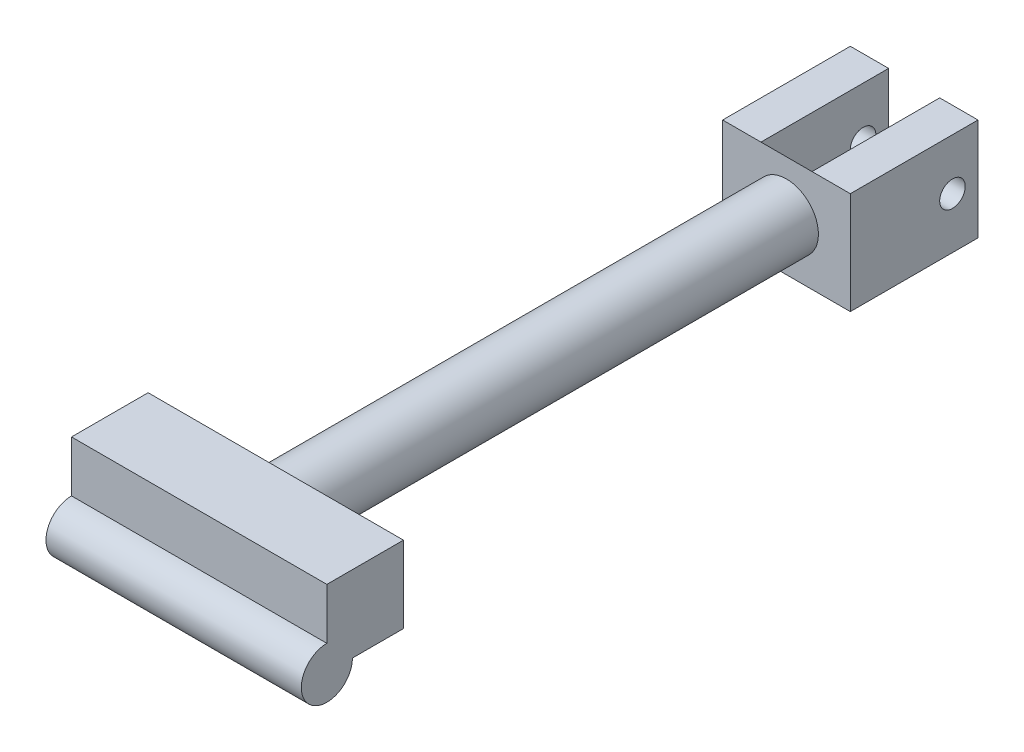
ISO-10303-21;
HEADER;
FILE_DESCRIPTION(('STEP AP214'),'2;1');
FILE_NAME('part.step','',(''),(''),'','','');
FILE_SCHEMA(('AUTOMOTIVE_DESIGN { 1 0 10303 214 1 1 1 1 }'));
ENDSEC;
DATA;
#1=APPLICATION_CONTEXT('core data for automotive mechanical design processes');
#2=APPLICATION_PROTOCOL_DEFINITION('international standard','automotive_design',2000,#1);
#3=PRODUCT_CONTEXT('',#1,'mechanical');
#4=PRODUCT('Part','Part','',(#3));
#5=PRODUCT_RELATED_PRODUCT_CATEGORY('part','',(#4));
#6=PRODUCT_DEFINITION_FORMATION('','',#4);
#7=PRODUCT_DEFINITION_CONTEXT('part definition',#1,'design');
#8=PRODUCT_DEFINITION('design','',#6,#7);
#9=PRODUCT_DEFINITION_SHAPE('','',#8);
#10=(LENGTH_UNIT() NAMED_UNIT(*) SI_UNIT(.MILLI.,.METRE.));
#11=(NAMED_UNIT(*) PLANE_ANGLE_UNIT() SI_UNIT($,.RADIAN.));
#12=(NAMED_UNIT(*) SI_UNIT($,.STERADIAN.) SOLID_ANGLE_UNIT());
#13=UNCERTAINTY_MEASURE_WITH_UNIT(LENGTH_MEASURE(1.E-05),#10,'distance_accuracy_value','');
#14=(GEOMETRIC_REPRESENTATION_CONTEXT(3) GLOBAL_UNCERTAINTY_ASSIGNED_CONTEXT((#13)) GLOBAL_UNIT_ASSIGNED_CONTEXT((#10,
#11,#12)) REPRESENTATION_CONTEXT('',''));
#15=CARTESIAN_POINT('',(0.,0.,0.));
#16=DIRECTION('',(0.,0.,1.));
#17=DIRECTION('',(1.,0.,0.));
#18=AXIS2_PLACEMENT_3D('',#15,#16,#17);
#19=CARTESIAN_POINT('',(25.,35.,-265.));
#20=DIRECTION('',(0.,-1.,0.));
#21=DIRECTION('',(0.,0.,-1.));
#22=AXIS2_PLACEMENT_3D('',#19,#20,#21);
#23=PLANE('',#22);
#24=DIRECTION('',(0.,0.,-1.));
#25=VECTOR('',#24,1.);
#26=CARTESIAN_POINT('',(10.,35.,-230.));
#27=LINE('',#26,#25);
#28=CARTESIAN_POINT('',(10.,35.,-215.));
#29=VERTEX_POINT('',#28);
#30=CARTESIAN_POINT('',(10.,35.,-265.));
#31=VERTEX_POINT('',#30);
#32=EDGE_CURVE('E56',#29,#31,#27,.T.);
#33=ORIENTED_EDGE('',*,*,#32,.F.);
#34=DIRECTION('',(1.,0.,0.));
#35=VECTOR('',#34,1.);
#36=CARTESIAN_POINT('',(25.,35.,-215.));
#37=LINE('',#36,#35);
#38=CARTESIAN_POINT('',(25.,35.,-215.));
#39=VERTEX_POINT('',#38);
#40=EDGE_CURVE('E191',#29,#39,#37,.T.);
#41=ORIENTED_EDGE('',*,*,#40,.T.);
#42=DIRECTION('',(0.,0.,1.));
#43=VECTOR('',#42,1.);
#44=CARTESIAN_POINT('',(25.,35.,-265.));
#45=LINE('',#44,#43);
#46=CARTESIAN_POINT('',(25.,35.,-265.));
#47=VERTEX_POINT('',#46);
#48=EDGE_CURVE('E211',#47,#39,#45,.T.);
#49=ORIENTED_EDGE('',*,*,#48,.F.);
#50=DIRECTION('',(1.,0.,0.));
#51=VECTOR('',#50,1.);
#52=CARTESIAN_POINT('',(25.,35.,-265.));
#53=LINE('',#52,#51);
#54=EDGE_CURVE('E173',#31,#47,#53,.T.);
#55=ORIENTED_EDGE('',*,*,#54,.F.);
#56=EDGE_LOOP('',(#33,#41,#49,#55));
#57=FACE_BOUND('',#56,.T.);
#58=ADVANCED_FACE('F39',(#57),#23,.F.);
#59=CARTESIAN_POINT('',(25.,-5.,-265.));
#60=DIRECTION('',(0.,1.,0.));
#61=DIRECTION('',(0.,0.,1.));
#62=AXIS2_PLACEMENT_3D('',#59,#60,#61);
#63=PLANE('',#62);
#64=DIRECTION('',(-1.,0.,0.));
#65=VECTOR('',#64,1.);
#66=CARTESIAN_POINT('',(25.,-5.,-215.));
#67=LINE('',#66,#65);
#68=CARTESIAN_POINT('',(25.,-5.,-215.));
#69=VERTEX_POINT('',#68);
#70=CARTESIAN_POINT('',(10.,-5.,-215.));
#71=VERTEX_POINT('',#70);
#72=EDGE_CURVE('E199',#69,#71,#67,.T.);
#73=ORIENTED_EDGE('',*,*,#72,.T.);
#74=DIRECTION('',(0.,0.,-1.));
#75=VECTOR('',#74,1.);
#76=CARTESIAN_POINT('',(10.,-5.,-265.));
#77=LINE('',#76,#75);
#78=CARTESIAN_POINT('',(10.,-5.,-265.));
#79=VERTEX_POINT('',#78);
#80=EDGE_CURVE('E310',#71,#79,#77,.T.);
#81=ORIENTED_EDGE('',*,*,#80,.T.);
#82=DIRECTION('',(-1.,0.,0.));
#83=VECTOR('',#82,1.);
#84=CARTESIAN_POINT('',(25.,-5.,-265.));
#85=LINE('',#84,#83);
#86=CARTESIAN_POINT('',(25.,-5.,-265.));
#87=VERTEX_POINT('',#86);
#88=EDGE_CURVE('E182',#87,#79,#85,.T.);
#89=ORIENTED_EDGE('',*,*,#88,.F.);
#90=DIRECTION('',(0.,0.,1.));
#91=VECTOR('',#90,1.);
#92=CARTESIAN_POINT('',(25.,-5.,-265.));
#93=LINE('',#92,#91);
#94=EDGE_CURVE('E207',#87,#69,#93,.T.);
#95=ORIENTED_EDGE('',*,*,#94,.T.);
#96=EDGE_LOOP('',(#73,#81,#89,#95));
#97=FACE_BOUND('',#96,.T.);
#98=ADVANCED_FACE('F352',(#97),#63,.F.);
#99=CARTESIAN_POINT('',(0.,0.,-265.));
#100=DIRECTION('',(0.,0.,-1.));
#101=DIRECTION('',(-1.,0.,0.));
#102=AXIS2_PLACEMENT_3D('',#99,#100,#101);
#103=PLANE('',#102);
#104=DIRECTION('',(0.,1.,0.));
#105=VECTOR('',#104,1.);
#106=CARTESIAN_POINT('',(-10.,0.,-265.));
#107=LINE('',#106,#105);
#108=CARTESIAN_POINT('',(-10.,-5.,-265.));
#109=VERTEX_POINT('',#108);
#110=CARTESIAN_POINT('',(-10.,35.,-265.));
#111=VERTEX_POINT('',#110);
#112=EDGE_CURVE('E145',#109,#111,#107,.T.);
#113=ORIENTED_EDGE('',*,*,#112,.F.);
#114=CARTESIAN_POINT('',(-25.,-5.,-265.));
#115=VERTEX_POINT('',#114);
#116=EDGE_CURVE('E177',#109,#115,#85,.T.);
#117=ORIENTED_EDGE('',*,*,#116,.T.);
#118=DIRECTION('',(0.,1.,0.));
#119=VECTOR('',#118,1.);
#120=CARTESIAN_POINT('',(-25.,35.,-265.));
#121=LINE('',#120,#119);
#122=CARTESIAN_POINT('',(-25.,35.,-265.));
#123=VERTEX_POINT('',#122);
#124=EDGE_CURVE('E169',#115,#123,#121,.T.);
#125=ORIENTED_EDGE('',*,*,#124,.T.);
#126=EDGE_CURVE('E160',#123,#111,#53,.T.);
#127=ORIENTED_EDGE('',*,*,#126,.T.);
#128=EDGE_LOOP('',(#113,#117,#125,#127));
#129=FACE_BOUND('',#128,.T.);
#130=ADVANCED_FACE('F167',(#129),#103,.T.);
#131=CARTESIAN_POINT('',(50.,30.,-15.));
#132=DIRECTION('',(-1.,0.,0.));
#133=DIRECTION('',(0.,0.,1.));
#134=AXIS2_PLACEMENT_3D('',#131,#132,#133);
#135=PLANE('',#134);
#136=DIRECTION('',(0.,-1.,0.));
#137=VECTOR('',#136,1.);
#138=CARTESIAN_POINT('',(50.,30.,15.));
#139=LINE('',#138,#137);
#140=CARTESIAN_POINT('',(50.,30.,15.));
#141=VERTEX_POINT('',#140);
#142=CARTESIAN_POINT('',(50.,10.,15.));
#143=VERTEX_POINT('',#142);
#144=EDGE_CURVE('E251',#141,#143,#139,.T.);
#145=ORIENTED_EDGE('',*,*,#144,.T.);
#146=CARTESIAN_POINT('',(50.,0.,15.));
#147=DIRECTION('',(1.,0.,0.));
#148=DIRECTION('',(0.,0.,-1.));
#149=AXIS2_PLACEMENT_3D('',#146,#147,#148);
#150=CIRCLE('',#149,10.);
#151=CARTESIAN_POINT('',(50.,0.,4.99999999999999));
#152=VERTEX_POINT('',#151);
#153=EDGE_CURVE('E222',#143,#152,#150,.T.);
#154=ORIENTED_EDGE('',*,*,#153,.T.);
#155=DIRECTION('',(0.,0.,-1.));
#156=VECTOR('',#155,1.);
#157=CARTESIAN_POINT('',(50.,0.,-15.));
#158=LINE('',#157,#156);
#159=CARTESIAN_POINT('',(50.,0.,-15.));
#160=VERTEX_POINT('',#159);
#161=EDGE_CURVE('E236',#152,#160,#158,.T.);
#162=ORIENTED_EDGE('',*,*,#161,.T.);
#163=DIRECTION('',(0.,-1.,0.));
#164=VECTOR('',#163,1.);
#165=CARTESIAN_POINT('',(50.,30.,-15.));
#166=LINE('',#165,#164);
#167=CARTESIAN_POINT('',(50.,30.,-15.));
#168=VERTEX_POINT('',#167);
#169=EDGE_CURVE('E271',#168,#160,#166,.T.);
#170=ORIENTED_EDGE('',*,*,#169,.F.);
#171=DIRECTION('',(0.,0.,-1.));
#172=VECTOR('',#171,1.);
#173=CARTESIAN_POINT('',(50.,30.,-15.));
#174=LINE('',#173,#172);
#175=EDGE_CURVE('E237',#141,#168,#174,.T.);
#176=ORIENTED_EDGE('',*,*,#175,.F.);
#177=EDGE_LOOP('',(#145,#154,#162,#170,#176));
#178=FACE_BOUND('',#177,.T.);
#179=ADVANCED_FACE('F421',(#178),#135,.F.);
#180=CARTESIAN_POINT('',(-50.,30.,-15.));
#181=DIRECTION('',(0.,0.,1.));
#182=DIRECTION('',(1.,0.,0.));
#183=AXIS2_PLACEMENT_3D('',#180,#181,#182);
#184=PLANE('',#183);
#185=CARTESIAN_POINT('',(0.,15.,-15.));
#186=DIRECTION('',(0.,0.,-1.));
#187=DIRECTION('',(-1.,0.,0.));
#188=AXIS2_PLACEMENT_3D('',#185,#186,#187);
#189=CIRCLE('',#188,12.5);
#190=CARTESIAN_POINT('',(12.5,15.,-15.));
#191=VERTEX_POINT('',#190);
#192=EDGE_CURVE('E154',#191,#191,#189,.T.);
#193=ORIENTED_EDGE('',*,*,#192,.F.);
#194=EDGE_LOOP('',(#193));
#195=FACE_BOUND('',#194,.T.);
#196=DIRECTION('',(-1.,0.,0.));
#197=VECTOR('',#196,1.);
#198=CARTESIAN_POINT('',(-50.,0.,-15.));
#199=LINE('',#198,#197);
#200=CARTESIAN_POINT('',(-50.,0.,-15.));
#201=VERTEX_POINT('',#200);
#202=EDGE_CURVE('E254',#160,#201,#199,.T.);
#203=ORIENTED_EDGE('',*,*,#202,.T.);
#204=DIRECTION('',(0.,-1.,0.));
#205=VECTOR('',#204,1.);
#206=CARTESIAN_POINT('',(-50.,30.,-15.));
#207=LINE('',#206,#205);
#208=CARTESIAN_POINT('',(-50.,30.,-15.));
#209=VERTEX_POINT('',#208);
#210=EDGE_CURVE('E267',#209,#201,#207,.T.);
#211=ORIENTED_EDGE('',*,*,#210,.F.);
#212=DIRECTION('',(-1.,0.,0.));
#213=VECTOR('',#212,1.);
#214=CARTESIAN_POINT('',(-50.,30.,-15.));
#215=LINE('',#214,#213);
#216=EDGE_CURVE('E241',#168,#209,#215,.T.);
#217=ORIENTED_EDGE('',*,*,#216,.F.);
#218=ORIENTED_EDGE('',*,*,#169,.T.);
#219=EDGE_LOOP('',(#203,#211,#217,#218));
#220=FACE_BOUND('',#219,.T.);
#221=ADVANCED_FACE('F424',(#195,#220),#184,.F.);
#222=CARTESIAN_POINT('',(-50.,30.,-15.));
#223=DIRECTION('',(1.,0.,0.));
#224=DIRECTION('',(0.,0.,-1.));
#225=AXIS2_PLACEMENT_3D('',#222,#223,#224);
#226=PLANE('',#225);
#227=DIRECTION('',(0.,0.,1.));
#228=VECTOR('',#227,1.);
#229=CARTESIAN_POINT('',(-50.,0.,-15.));
#230=LINE('',#229,#228);
#231=CARTESIAN_POINT('',(-50.,0.,4.99999999999997));
#232=VERTEX_POINT('',#231);
#233=EDGE_CURVE('E242',#201,#232,#230,.T.);
#234=ORIENTED_EDGE('',*,*,#233,.T.);
#235=CARTESIAN_POINT('',(-50.,0.,15.));
#236=DIRECTION('',(1.,0.,0.));
#237=DIRECTION('',(0.,0.,-1.));
#238=AXIS2_PLACEMENT_3D('',#235,#236,#237);
#239=CIRCLE('',#238,10.);
#240=CARTESIAN_POINT('',(-50.,10.,15.));
#241=VERTEX_POINT('',#240);
#242=EDGE_CURVE('E227',#241,#232,#239,.T.);
#243=ORIENTED_EDGE('',*,*,#242,.F.);
#244=DIRECTION('',(0.,-1.,0.));
#245=VECTOR('',#244,1.);
#246=CARTESIAN_POINT('',(-50.,30.,15.));
#247=LINE('',#246,#245);
#248=CARTESIAN_POINT('',(-50.,30.,15.));
#249=VERTEX_POINT('',#248);
#250=EDGE_CURVE('E263',#249,#241,#247,.T.);
#251=ORIENTED_EDGE('',*,*,#250,.F.);
#252=DIRECTION('',(0.,0.,1.));
#253=VECTOR('',#252,1.);
#254=CARTESIAN_POINT('',(-50.,30.,-15.));
#255=LINE('',#254,#253);
#256=EDGE_CURVE('E245',#209,#249,#255,.T.);
#257=ORIENTED_EDGE('',*,*,#256,.F.);
#258=ORIENTED_EDGE('',*,*,#210,.T.);
#259=EDGE_LOOP('',(#234,#243,#251,#257,#258));
#260=FACE_BOUND('',#259,.T.);
#261=ADVANCED_FACE('F428',(#260),#226,.F.);
#262=CARTESIAN_POINT('',(-50.,30.,15.));
#263=DIRECTION('',(0.,0.,-1.));
#264=DIRECTION('',(-1.,0.,0.));
#265=AXIS2_PLACEMENT_3D('',#262,#263,#264);
#266=PLANE('',#265);
#267=ORIENTED_EDGE('',*,*,#250,.T.);
#268=DIRECTION('',(1.,0.,0.));
#269=VECTOR('',#268,1.);
#270=CARTESIAN_POINT('',(-50.,10.,15.));
#271=LINE('',#270,#269);
#272=EDGE_CURVE('E230',#241,#143,#271,.T.);
#273=ORIENTED_EDGE('',*,*,#272,.T.);
#274=ORIENTED_EDGE('',*,*,#144,.F.);
#275=DIRECTION('',(1.,0.,0.));
#276=VECTOR('',#275,1.);
#277=CARTESIAN_POINT('',(-50.,30.,15.));
#278=LINE('',#277,#276);
#279=EDGE_CURVE('E248',#249,#141,#278,.T.);
#280=ORIENTED_EDGE('',*,*,#279,.F.);
#281=EDGE_LOOP('',(#267,#273,#274,#280));
#282=FACE_BOUND('',#281,.T.);
#283=ADVANCED_FACE('F432',(#282),#266,.F.);
#284=CARTESIAN_POINT('',(0.,30.,0.));
#285=DIRECTION('',(0.,1.,0.));
#286=DIRECTION('',(0.,0.,1.));
#287=AXIS2_PLACEMENT_3D('',#284,#285,#286);
#288=PLANE('',#287);
#289=ORIENTED_EDGE('',*,*,#175,.T.);
#290=ORIENTED_EDGE('',*,*,#216,.T.);
#291=ORIENTED_EDGE('',*,*,#256,.T.);
#292=ORIENTED_EDGE('',*,*,#279,.T.);
#293=EDGE_LOOP('',(#289,#290,#291,#292));
#294=FACE_BOUND('',#293,.T.);
#295=ADVANCED_FACE('F436',(#294),#288,.T.);
#296=CARTESIAN_POINT('',(0.,0.,0.));
#297=DIRECTION('',(0.,1.,0.));
#298=DIRECTION('',(0.,0.,1.));
#299=AXIS2_PLACEMENT_3D('',#296,#297,#298);
#300=PLANE('',#299);
#301=ORIENTED_EDGE('',*,*,#161,.F.);
#302=DIRECTION('',(1.,0.,0.));
#303=VECTOR('',#302,1.);
#304=CARTESIAN_POINT('',(-50.,0.,4.99999999999997));
#305=LINE('',#304,#303);
#306=EDGE_CURVE('E226',#152,#232,#305,.F.);
#307=ORIENTED_EDGE('',*,*,#306,.T.);
#308=ORIENTED_EDGE('',*,*,#233,.F.);
#309=ORIENTED_EDGE('',*,*,#202,.F.);
#310=EDGE_LOOP('',(#301,#307,#308,#309));
#311=FACE_BOUND('',#310,.T.);
#312=ADVANCED_FACE('F438',(#311),#300,.F.);
#313=CARTESIAN_POINT('',(-50.,0.,15.));
#314=DIRECTION('',(1.,0.,0.));
#315=DIRECTION('',(0.,0.,-1.));
#316=AXIS2_PLACEMENT_3D('',#313,#314,#315);
#317=CYLINDRICAL_SURFACE('',#316,10.);
#318=ORIENTED_EDGE('',*,*,#272,.F.);
#319=ORIENTED_EDGE('',*,*,#242,.T.);
#320=ORIENTED_EDGE('',*,*,#306,.F.);
#321=ORIENTED_EDGE('',*,*,#153,.F.);
#322=EDGE_LOOP('',(#318,#319,#320,#321));
#323=FACE_BOUND('',#322,.T.);
#324=ADVANCED_FACE('F375',(#323),#317,.T.);
#325=CARTESIAN_POINT('',(0.,15.,-215.));
#326=DIRECTION('',(0.,0.,1.));
#327=DIRECTION('',(1.,0.,0.));
#328=AXIS2_PLACEMENT_3D('',#325,#326,#327);
#329=CYLINDRICAL_SURFACE('',#328,12.5);
#330=CARTESIAN_POINT('',(0.,15.,-215.));
#331=DIRECTION('',(0.,0.,-1.));
#332=DIRECTION('',(-1.,0.,0.));
#333=AXIS2_PLACEMENT_3D('',#330,#331,#332);
#334=CIRCLE('',#333,12.5);
#335=CARTESIAN_POINT('',(12.5,15.,-215.));
#336=VERTEX_POINT('',#335);
#337=EDGE_CURVE('E218',#336,#336,#334,.T.);
#338=CARTESIAN_POINT('',(12.5,15.,-215.));
#339=CARTESIAN_POINT('',(12.5,15.,-212.916666666667));
#340=CARTESIAN_POINT('',(12.5,15.,-210.833333333333));
#341=CARTESIAN_POINT('',(12.5,15.,-206.666666666667));
#342=CARTESIAN_POINT('',(12.5,15.,-204.583333333333));
#343=CARTESIAN_POINT('',(12.5,15.,-200.416666666667));
#344=CARTESIAN_POINT('',(12.5,15.,-198.333333333333));
#345=CARTESIAN_POINT('',(12.5,15.,-194.166666666667));
#346=CARTESIAN_POINT('',(12.5,15.,-192.083333333333));
#347=CARTESIAN_POINT('',(12.5,15.,-187.916666666667));
#348=CARTESIAN_POINT('',(12.5,15.,-185.833333333333));
#349=CARTESIAN_POINT('',(12.5,15.,-181.666666666667));
#350=CARTESIAN_POINT('',(12.5,15.,-179.583333333333));
#351=CARTESIAN_POINT('',(12.5,15.,-175.416666666667));
#352=CARTESIAN_POINT('',(12.5,15.,-173.333333333333));
#353=CARTESIAN_POINT('',(12.5,15.,-169.166666666667));
#354=CARTESIAN_POINT('',(12.5,15.,-167.083333333333));
#355=CARTESIAN_POINT('',(12.5,15.,-162.916666666667));
#356=CARTESIAN_POINT('',(12.5,15.,-160.833333333333));
#357=CARTESIAN_POINT('',(12.5,15.,-156.666666666667));
#358=CARTESIAN_POINT('',(12.5,15.,-154.583333333333));
#359=CARTESIAN_POINT('',(12.5,15.,-150.416666666667));
#360=CARTESIAN_POINT('',(12.5,15.,-148.333333333333));
#361=CARTESIAN_POINT('',(12.5,15.,-144.166666666667));
#362=CARTESIAN_POINT('',(12.5,15.,-142.083333333333));
#363=CARTESIAN_POINT('',(12.5,15.,-137.916666666667));
#364=CARTESIAN_POINT('',(12.5,15.,-135.833333333333));
#365=CARTESIAN_POINT('',(12.5,15.,-131.666666666667));
#366=CARTESIAN_POINT('',(12.5,15.,-129.583333333333));
#367=CARTESIAN_POINT('',(12.5,15.,-125.416666666667));
#368=CARTESIAN_POINT('',(12.5,15.,-123.333333333333));
#369=CARTESIAN_POINT('',(12.5,15.,-119.166666666667));
#370=CARTESIAN_POINT('',(12.5,15.,-117.083333333333));
#371=CARTESIAN_POINT('',(12.5,15.,-112.916666666667));
#372=CARTESIAN_POINT('',(12.5,15.,-110.833333333333));
#373=CARTESIAN_POINT('',(12.5,15.,-106.666666666667));
#374=CARTESIAN_POINT('',(12.5,15.,-104.583333333333));
#375=CARTESIAN_POINT('',(12.5,15.,-100.416666666667));
#376=CARTESIAN_POINT('',(12.5,15.,-98.3333333333334));
#377=CARTESIAN_POINT('',(12.5,15.,-94.1666666666667));
#378=CARTESIAN_POINT('',(12.5,15.,-92.0833333333334));
#379=CARTESIAN_POINT('',(12.5,15.,-87.9166666666667));
#380=CARTESIAN_POINT('',(12.5,15.,-85.8333333333334));
#381=CARTESIAN_POINT('',(12.5,15.,-81.6666666666667));
#382=CARTESIAN_POINT('',(12.5,15.,-79.5833333333334));
#383=CARTESIAN_POINT('',(12.5,15.,-75.4166666666667));
#384=CARTESIAN_POINT('',(12.5,15.,-73.3333333333334));
#385=CARTESIAN_POINT('',(12.5,15.,-69.1666666666667));
#386=CARTESIAN_POINT('',(12.5,15.,-67.0833333333334));
#387=CARTESIAN_POINT('',(12.5,15.,-62.9166666666667));
#388=CARTESIAN_POINT('',(12.5,15.,-60.8333333333334));
#389=CARTESIAN_POINT('',(12.5,15.,-56.6666666666667));
#390=CARTESIAN_POINT('',(12.5,15.,-54.5833333333333));
#391=CARTESIAN_POINT('',(12.5,15.,-50.4166666666667));
#392=CARTESIAN_POINT('',(12.5,15.,-48.3333333333334));
#393=CARTESIAN_POINT('',(12.5,15.,-44.1666666666667));
#394=CARTESIAN_POINT('',(12.5,15.,-42.0833333333334));
#395=CARTESIAN_POINT('',(12.5,15.,-37.9166666666667));
#396=CARTESIAN_POINT('',(12.5,15.,-35.8333333333334));
#397=CARTESIAN_POINT('',(12.5,15.,-31.6666666666667));
#398=CARTESIAN_POINT('',(12.5,15.,-29.5833333333334));
#399=CARTESIAN_POINT('',(12.5,15.,-25.4166666666667));
#400=CARTESIAN_POINT('',(12.5,15.,-23.3333333333334));
#401=CARTESIAN_POINT('',(12.5,15.,-19.1666666666667));
#402=CARTESIAN_POINT('',(12.5,15.,-17.0833333333333));
#403=CARTESIAN_POINT('',(12.5,15.,-15.));
#404=B_SPLINE_CURVE_WITH_KNOTS('',3,(#338,#339,#340,#341,#342,#343,#344,#345,#346,#347,#348,
#349,#350,#351,#352,#353,#354,#355,#356,#357,#358,#359,#360,#361,#362,#363,#364,#365,#366,#367,
#368,#369,#370,#371,#372,#373,#374,#375,#376,#377,#378,#379,#380,#381,#382,#383,#384,#385,#386,
#387,#388,#389,#390,#391,#392,#393,#394,#395,#396,#397,#398,#399,#400,#401,#402,#403),
.UNSPECIFIED.,.F.,.F.,(4,2,2,2,2,2,2,2,2,2,2,2,2,2,2,2,2,2,2,2,2,2,2,2,2,2,2,2,2,2,2,2,4),(0.,
6.24999999999998,12.5,18.75,25.,31.25,37.5,43.75,50.,56.25,62.5,68.75,75.,81.25,87.5,93.75,100.,
106.25,112.5,118.75,125.,131.25,137.5,143.75,150.,156.25,162.5,168.75,175.,181.25,187.5,193.75,
200.),.UNSPECIFIED.);
#405=EDGE_CURVE('BSEAM367',#336,#191,#404,.T.);
#406=ORIENTED_EDGE('',*,*,#337,.F.);
#407=ORIENTED_EDGE('',*,*,#192,.T.);
#408=ORIENTED_EDGE('',*,*,#405,.T.);
#409=ORIENTED_EDGE('',*,*,#405,.F.);
#410=EDGE_LOOP('',(#406,#408,#407,#409));
#411=FACE_BOUND('',#410,.T.);
#412=ADVANCED_FACE('F367',(#411),#329,.T.);
#413=CARTESIAN_POINT('',(-25.,35.,-265.));
#414=DIRECTION('',(1.,0.,0.));
#415=DIRECTION('',(0.,1.,0.));
#416=AXIS2_PLACEMENT_3D('',#413,#414,#415);
#417=PLANE('',#416);
#418=CARTESIAN_POINT('',(-25.,15.,-255.));
#419=DIRECTION('',(1.,0.,0.));
#420=DIRECTION('',(0.,1.,0.));
#421=AXIS2_PLACEMENT_3D('',#418,#419,#420);
#422=CIRCLE('',#421,4.99999999999999);
#423=CARTESIAN_POINT('',(-25.,20.,-255.));
#424=VERTEX_POINT('',#423);
#425=EDGE_CURVE('E324',#424,#424,#422,.T.);
#426=ORIENTED_EDGE('',*,*,#425,.T.);
#427=EDGE_LOOP('',(#426));
#428=FACE_BOUND('',#427,.T.);
#429=DIRECTION('',(0.,1.,0.));
#430=VECTOR('',#429,1.);
#431=CARTESIAN_POINT('',(-25.,35.,-215.));
#432=LINE('',#431,#430);
#433=CARTESIAN_POINT('',(-25.,-5.,-215.));
#434=VERTEX_POINT('',#433);
#435=CARTESIAN_POINT('',(-25.,35.,-215.));
#436=VERTEX_POINT('',#435);
#437=EDGE_CURVE('E187',#434,#436,#432,.T.);
#438=ORIENTED_EDGE('',*,*,#437,.T.);
#439=DIRECTION('',(0.,0.,1.));
#440=VECTOR('',#439,1.);
#441=CARTESIAN_POINT('',(-25.,35.,-265.));
#442=LINE('',#441,#440);
#443=EDGE_CURVE('E215',#123,#436,#442,.T.);
#444=ORIENTED_EDGE('',*,*,#443,.F.);
#445=ORIENTED_EDGE('',*,*,#124,.F.);
#446=DIRECTION('',(0.,0.,1.));
#447=VECTOR('',#446,1.);
#448=CARTESIAN_POINT('',(-25.,-5.,-265.));
#449=LINE('',#448,#447);
#450=EDGE_CURVE('E186',#115,#434,#449,.T.);
#451=ORIENTED_EDGE('',*,*,#450,.T.);
#452=EDGE_LOOP('',(#438,#444,#445,#451));
#453=FACE_BOUND('',#452,.T.);
#454=ADVANCED_FACE('F364',(#428,#453),#417,.F.);
#455=CARTESIAN_POINT('',(-9.99999999999999,35.,-215.));
#456=VERTEX_POINT('',#455);
#457=EDGE_CURVE('E162',#436,#456,#37,.T.);
#458=ORIENTED_EDGE('',*,*,#457,.T.);
#459=DIRECTION('',(0.,0.,-1.));
#460=VECTOR('',#459,1.);
#461=CARTESIAN_POINT('',(-10.,35.,-230.));
#462=LINE('',#461,#460);
#463=EDGE_CURVE('E63',#456,#111,#462,.T.);
#464=ORIENTED_EDGE('',*,*,#463,.T.);
#465=ORIENTED_EDGE('',*,*,#126,.F.);
#466=ORIENTED_EDGE('',*,*,#443,.T.);
#467=EDGE_LOOP('',(#458,#464,#465,#466));
#468=FACE_BOUND('',#467,.T.);
#469=ADVANCED_FACE('F158',(#468),#23,.F.);
#470=CARTESIAN_POINT('',(25.,35.,-265.));
#471=DIRECTION('',(-1.,0.,0.));
#472=DIRECTION('',(0.,-1.,0.));
#473=AXIS2_PLACEMENT_3D('',#470,#471,#472);
#474=PLANE('',#473);
#475=CARTESIAN_POINT('',(25.,15.,-255.));
#476=DIRECTION('',(1.,0.,0.));
#477=DIRECTION('',(0.,1.,0.));
#478=AXIS2_PLACEMENT_3D('',#475,#476,#477);
#479=CIRCLE('',#478,4.99999999999999);
#480=CARTESIAN_POINT('',(25.,20.,-255.));
#481=VERTEX_POINT('',#480);
#482=EDGE_CURVE('E335',#481,#481,#479,.T.);
#483=ORIENTED_EDGE('',*,*,#482,.F.);
#484=EDGE_LOOP('',(#483));
#485=FACE_BOUND('',#484,.T.);
#486=DIRECTION('',(0.,-1.,0.));
#487=VECTOR('',#486,1.);
#488=CARTESIAN_POINT('',(25.,35.,-215.));
#489=LINE('',#488,#487);
#490=EDGE_CURVE('E194',#39,#69,#489,.T.);
#491=ORIENTED_EDGE('',*,*,#490,.T.);
#492=ORIENTED_EDGE('',*,*,#94,.F.);
#493=DIRECTION('',(0.,-1.,0.));
#494=VECTOR('',#493,1.);
#495=CARTESIAN_POINT('',(25.,35.,-265.));
#496=LINE('',#495,#494);
#497=EDGE_CURVE('E172',#47,#87,#496,.T.);
#498=ORIENTED_EDGE('',*,*,#497,.F.);
#499=ORIENTED_EDGE('',*,*,#48,.T.);
#500=EDGE_LOOP('',(#491,#492,#498,#499));
#501=FACE_BOUND('',#500,.T.);
#502=ADVANCED_FACE('F343',(#485,#501),#474,.F.);
#503=DIRECTION('',(0.,0.,1.));
#504=VECTOR('',#503,1.);
#505=CARTESIAN_POINT('',(-10.,-5.,-265.));
#506=LINE('',#505,#504);
#507=CARTESIAN_POINT('',(-10.,-5.,-215.));
#508=VERTEX_POINT('',#507);
#509=EDGE_CURVE('E148',#109,#508,#506,.T.);
#510=ORIENTED_EDGE('',*,*,#509,.T.);
#511=EDGE_CURVE('E198',#508,#434,#67,.T.);
#512=ORIENTED_EDGE('',*,*,#511,.T.);
#513=ORIENTED_EDGE('',*,*,#450,.F.);
#514=ORIENTED_EDGE('',*,*,#116,.F.);
#515=EDGE_LOOP('',(#510,#512,#513,#514));
#516=FACE_BOUND('',#515,.T.);
#517=ADVANCED_FACE('F346',(#516),#63,.F.);
#518=DIRECTION('',(0.,-1.,0.));
#519=VECTOR('',#518,1.);
#520=CARTESIAN_POINT('',(10.,-35.,-265.));
#521=LINE('',#520,#519);
#522=EDGE_CURVE('E321',#31,#79,#521,.T.);
#523=ORIENTED_EDGE('',*,*,#522,.F.);
#524=ORIENTED_EDGE('',*,*,#54,.T.);
#525=ORIENTED_EDGE('',*,*,#497,.T.);
#526=ORIENTED_EDGE('',*,*,#88,.T.);
#527=EDGE_LOOP('',(#523,#524,#525,#526));
#528=FACE_BOUND('',#527,.T.);
#529=ADVANCED_FACE('F385',(#528),#103,.T.);
#530=CARTESIAN_POINT('',(0.,0.,-215.));
#531=DIRECTION('',(0.,0.,-1.));
#532=DIRECTION('',(-1.,0.,0.));
#533=AXIS2_PLACEMENT_3D('',#530,#531,#532);
#534=PLANE('',#533);
#535=ORIENTED_EDGE('',*,*,#337,.T.);
#536=EDGE_LOOP('',(#535));
#537=FACE_BOUND('',#536,.T.);
#538=ORIENTED_EDGE('',*,*,#437,.F.);
#539=ORIENTED_EDGE('',*,*,#511,.F.);
#540=EDGE_CURVE('E203',#71,#508,#67,.T.);
#541=ORIENTED_EDGE('',*,*,#540,.F.);
#542=ORIENTED_EDGE('',*,*,#72,.F.);
#543=ORIENTED_EDGE('',*,*,#490,.F.);
#544=ORIENTED_EDGE('',*,*,#40,.F.);
#545=EDGE_CURVE('E195',#456,#29,#37,.T.);
#546=ORIENTED_EDGE('',*,*,#545,.F.);
#547=ORIENTED_EDGE('',*,*,#457,.F.);
#548=EDGE_LOOP('',(#538,#539,#541,#542,#543,#544,#546,#547));
#549=FACE_BOUND('',#548,.T.);
#550=ADVANCED_FACE('F303',(#537,#549),#534,.F.);
#551=CARTESIAN_POINT('',(0.,0.,-230.));
#552=DIRECTION('',(0.,0.,1.));
#553=DIRECTION('',(1.,0.,0.));
#554=AXIS2_PLACEMENT_3D('',#551,#552,#553);
#555=PLANE('',#554);
#556=DIRECTION('',(0.,-1.,0.));
#557=VECTOR('',#556,1.);
#558=CARTESIAN_POINT('',(10.,-35.,-230.));
#559=LINE('',#558,#557);
#560=CARTESIAN_POINT('',(10.,20.,-230.));
#561=VERTEX_POINT('',#560);
#562=CARTESIAN_POINT('',(10.,10.0000000000001,-230.));
#563=VERTEX_POINT('',#562);
#564=EDGE_CURVE('E165',#561,#563,#559,.T.);
#565=ORIENTED_EDGE('',*,*,#564,.T.);
#566=DIRECTION('',(-1.,0.,0.));
#567=VECTOR('',#566,1.);
#568=CARTESIAN_POINT('',(0.,10.0000000000001,-230.));
#569=LINE('',#568,#567);
#570=CARTESIAN_POINT('',(-10.,10.0000000000001,-230.));
#571=VERTEX_POINT('',#570);
#572=EDGE_CURVE('E281',#563,#571,#569,.T.);
#573=ORIENTED_EDGE('',*,*,#572,.T.);
#574=DIRECTION('',(0.,1.,0.));
#575=VECTOR('',#574,1.);
#576=CARTESIAN_POINT('',(-10.,-35.,-230.));
#577=LINE('',#576,#575);
#578=CARTESIAN_POINT('',(-10.,20.,-230.));
#579=VERTEX_POINT('',#578);
#580=EDGE_CURVE('E317',#571,#579,#577,.T.);
#581=ORIENTED_EDGE('',*,*,#580,.T.);
#582=DIRECTION('',(1.,0.,0.));
#583=VECTOR('',#582,1.);
#584=CARTESIAN_POINT('',(0.,20.,-230.));
#585=LINE('',#584,#583);
#586=EDGE_CURVE('E153',#579,#561,#585,.T.);
#587=ORIENTED_EDGE('',*,*,#586,.T.);
#588=EDGE_LOOP('',(#565,#573,#581,#587));
#589=FACE_BOUND('',#588,.T.);
#590=ADVANCED_FACE('F388',(#589),#555,.F.);
#591=CARTESIAN_POINT('',(-10.,-35.,-230.));
#592=DIRECTION('',(-1.,0.,0.));
#593=DIRECTION('',(0.,0.,1.));
#594=AXIS2_PLACEMENT_3D('',#591,#592,#593);
#595=PLANE('',#594);
#596=CARTESIAN_POINT('',(-10.,15.,-255.));
#597=DIRECTION('',(-1.,0.,0.));
#598=DIRECTION('',(0.,0.,1.));
#599=AXIS2_PLACEMENT_3D('',#596,#597,#598);
#600=CIRCLE('',#599,4.99999999999999);
#601=CARTESIAN_POINT('',(-10.,15.,-250.));
#602=VERTEX_POINT('',#601);
#603=EDGE_CURVE('E328',#602,#602,#600,.T.);
#604=ORIENTED_EDGE('',*,*,#603,.T.);
#605=EDGE_LOOP('',(#604));
#606=FACE_BOUND('',#605,.T.);
#607=ORIENTED_EDGE('',*,*,#112,.T.);
#608=ORIENTED_EDGE('',*,*,#463,.F.);
#609=DIRECTION('',(0.,0.707106781186546,0.707106781186549));
#610=VECTOR('',#609,1.);
#611=CARTESIAN_POINT('',(-10.,-7.49999999999991,-257.5));
#612=LINE('',#611,#610);
#613=EDGE_CURVE('E11',#456,#579,#612,.F.);
#614=ORIENTED_EDGE('',*,*,#613,.T.);
#615=ORIENTED_EDGE('',*,*,#580,.F.);
#616=DIRECTION('',(0.,0.707106781186549,-0.707106781186546));
#617=VECTOR('',#616,1.);
#618=CARTESIAN_POINT('',(-10.,-12.5,-207.5));
#619=LINE('',#618,#617);
#620=EDGE_CURVE('E287',#571,#508,#619,.F.);
#621=ORIENTED_EDGE('',*,*,#620,.T.);
#622=ORIENTED_EDGE('',*,*,#509,.F.);
#623=EDGE_LOOP('',(#607,#608,#614,#615,#621,#622));
#624=FACE_BOUND('',#623,.T.);
#625=ADVANCED_FACE('F146',(#606,#624),#595,.F.);
#626=CARTESIAN_POINT('',(10.,-35.,-230.));
#627=DIRECTION('',(1.,0.,0.));
#628=DIRECTION('',(0.,0.,-1.));
#629=AXIS2_PLACEMENT_3D('',#626,#627,#628);
#630=PLANE('',#629);
#631=CARTESIAN_POINT('',(10.,15.,-255.));
#632=DIRECTION('',(1.,0.,0.));
#633=DIRECTION('',(0.,0.,-1.));
#634=AXIS2_PLACEMENT_3D('',#631,#632,#633);
#635=CIRCLE('',#634,4.99999999999999);
#636=CARTESIAN_POINT('',(10.,15.,-260.));
#637=VERTEX_POINT('',#636);
#638=EDGE_CURVE('E43',#637,#637,#635,.T.);
#639=ORIENTED_EDGE('',*,*,#638,.T.);
#640=EDGE_LOOP('',(#639));
#641=FACE_BOUND('',#640,.T.);
#642=ORIENTED_EDGE('',*,*,#564,.F.);
#643=DIRECTION('',(0.,-0.707106781186546,-0.707106781186549));
#644=VECTOR('',#643,1.);
#645=CARTESIAN_POINT('',(10.,-7.49999999999991,-257.5));
#646=LINE('',#645,#644);
#647=EDGE_CURVE('E49',#561,#29,#646,.F.);
#648=ORIENTED_EDGE('',*,*,#647,.T.);
#649=ORIENTED_EDGE('',*,*,#32,.T.);
#650=ORIENTED_EDGE('',*,*,#522,.T.);
#651=ORIENTED_EDGE('',*,*,#80,.F.);
#652=DIRECTION('',(0.,-0.707106781186549,0.707106781186546));
#653=VECTOR('',#652,1.);
#654=CARTESIAN_POINT('',(10.,-12.5,-207.5));
#655=LINE('',#654,#653);
#656=EDGE_CURVE('E284',#71,#563,#655,.F.);
#657=ORIENTED_EDGE('',*,*,#656,.T.);
#658=EDGE_LOOP('',(#642,#648,#649,#650,#651,#657));
#659=FACE_BOUND('',#658,.T.);
#660=ADVANCED_FACE('F294',(#641,#659),#630,.F.);
#661=CARTESIAN_POINT('',(25.,-5.,-215.));
#662=DIRECTION('',(0.,0.707106781186546,0.707106781186549));
#663=DIRECTION('',(1.,0.,0.));
#664=AXIS2_PLACEMENT_3D('',#661,#662,#663);
#665=PLANE('',#664);
#666=ORIENTED_EDGE('',*,*,#620,.F.);
#667=ORIENTED_EDGE('',*,*,#572,.F.);
#668=ORIENTED_EDGE('',*,*,#656,.F.);
#669=ORIENTED_EDGE('',*,*,#540,.T.);
#670=EDGE_LOOP('',(#666,#667,#668,#669));
#671=FACE_BOUND('',#670,.T.);
#672=ADVANCED_FACE('F398',(#671),#665,.F.);
#673=CARTESIAN_POINT('',(0.,20.,-230.));
#674=DIRECTION('',(0.,-0.707106781186549,0.707106781186546));
#675=DIRECTION('',(1.,0.,0.));
#676=AXIS2_PLACEMENT_3D('',#673,#674,#675);
#677=PLANE('',#676);
#678=ORIENTED_EDGE('',*,*,#613,.F.);
#679=ORIENTED_EDGE('',*,*,#545,.T.);
#680=ORIENTED_EDGE('',*,*,#647,.F.);
#681=ORIENTED_EDGE('',*,*,#586,.F.);
#682=EDGE_LOOP('',(#678,#679,#680,#681));
#683=FACE_BOUND('',#682,.T.);
#684=ADVANCED_FACE('F41',(#683),#677,.F.);
#685=CARTESIAN_POINT('',(-29.,15.,-255.));
#686=DIRECTION('',(1.,0.,0.));
#687=DIRECTION('',(0.,1.,0.));
#688=AXIS2_PLACEMENT_3D('',#685,#686,#687);
#689=CYLINDRICAL_SURFACE('',#688,4.99999999999999);
#690=ORIENTED_EDGE('',*,*,#482,.T.);
#691=EDGE_LOOP('',(#690));
#692=FACE_BOUND('',#691,.T.);
#693=ORIENTED_EDGE('',*,*,#638,.F.);
#694=EDGE_LOOP('',(#693));
#695=FACE_BOUND('',#694,.T.);
#696=ADVANCED_FACE('F340',(#692,#695),#689,.F.);
#697=ORIENTED_EDGE('',*,*,#603,.F.);
#698=EDGE_LOOP('',(#697));
#699=FACE_BOUND('',#698,.T.);
#700=ORIENTED_EDGE('',*,*,#425,.F.);
#701=EDGE_LOOP('',(#700));
#702=FACE_BOUND('',#701,.T.);
#703=ADVANCED_FACE('F403',(#699,#702),#689,.F.);
#704=CLOSED_SHELL('',(#58,#98,#130,#179,#221,#261,#283,#295,#312,#324,#412,#454,#469,#502,#517,
#529,#550,#590,#625,#660,#672,#684,#696,#703));
#705=MANIFOLD_SOLID_BREP('B2',#704);
#706=ADVANCED_BREP_SHAPE_REPRESENTATION('',(#18,#705),#14);
#707=SHAPE_DEFINITION_REPRESENTATION(#9,#706);
ENDSEC;
END-ISO-10303-21;
